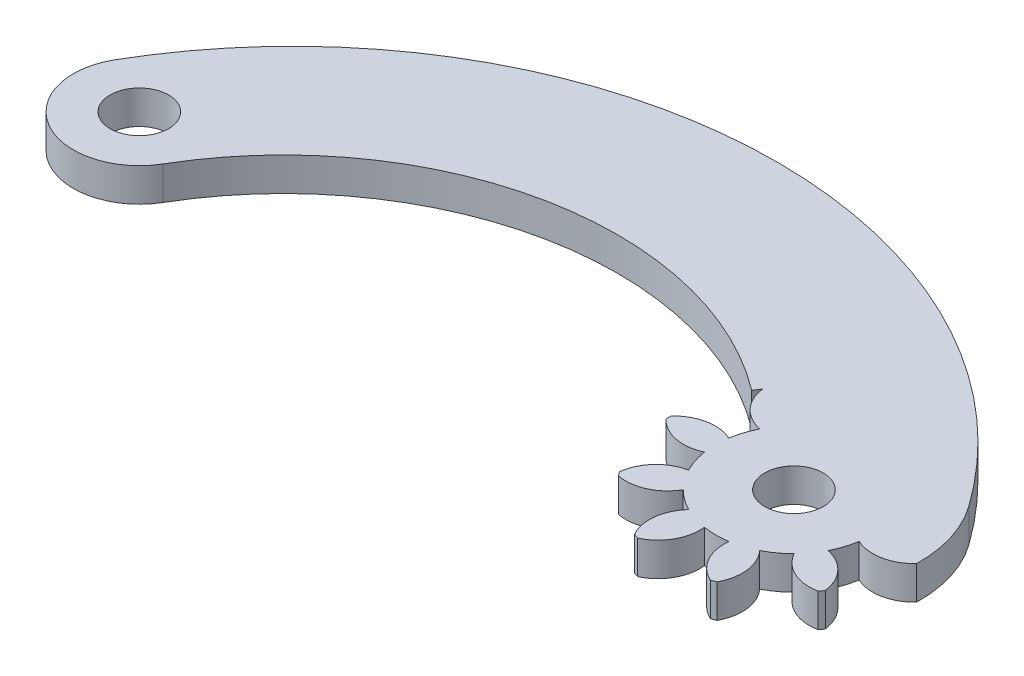
ISO-10303-21;
HEADER;
FILE_DESCRIPTION(('STEP AP214'),'2;1');
FILE_NAME('part.step','',(''),(''),'','','');
FILE_SCHEMA(('AUTOMOTIVE_DESIGN { 1 0 10303 214 1 1 1 1 }'));
ENDSEC;
DATA;
#1=APPLICATION_CONTEXT('core data for automotive mechanical design processes');
#2=APPLICATION_PROTOCOL_DEFINITION('international standard','automotive_design',2000,#1);
#3=PRODUCT_CONTEXT('',#1,'mechanical');
#4=PRODUCT('Part','Part','',(#3));
#5=PRODUCT_RELATED_PRODUCT_CATEGORY('part','',(#4));
#6=PRODUCT_DEFINITION_FORMATION('','',#4);
#7=PRODUCT_DEFINITION_CONTEXT('part definition',#1,'design');
#8=PRODUCT_DEFINITION('design','',#6,#7);
#9=PRODUCT_DEFINITION_SHAPE('','',#8);
#10=(LENGTH_UNIT() NAMED_UNIT(*) SI_UNIT(.MILLI.,.METRE.));
#11=(NAMED_UNIT(*) PLANE_ANGLE_UNIT() SI_UNIT($,.RADIAN.));
#12=(NAMED_UNIT(*) SI_UNIT($,.STERADIAN.) SOLID_ANGLE_UNIT());
#13=UNCERTAINTY_MEASURE_WITH_UNIT(LENGTH_MEASURE(1.E-05),#10,'distance_accuracy_value','');
#14=(GEOMETRIC_REPRESENTATION_CONTEXT(3) GLOBAL_UNCERTAINTY_ASSIGNED_CONTEXT((#13)) GLOBAL_UNIT_ASSIGNED_CONTEXT((#10,
#11,#12)) REPRESENTATION_CONTEXT('',''));
#15=CARTESIAN_POINT('',(0.,0.,0.));
#16=DIRECTION('',(0.,0.,1.));
#17=DIRECTION('',(1.,0.,0.));
#18=AXIS2_PLACEMENT_3D('',#15,#16,#17);
#19=CARTESIAN_POINT('',(29.9352924032025,1.,6.02984649181474));
#20=DIRECTION('',(0.,-1.,0.));
#21=DIRECTION('',(0.,0.,-1.));
#22=AXIS2_PLACEMENT_3D('',#19,#20,#21);
#23=PLANE('',#22);
#24=CARTESIAN_POINT('',(0.,1.,0.));
#25=DIRECTION('',(0.,1.,0.));
#26=DIRECTION('',(0.,0.,1.));
#27=AXIS2_PLACEMENT_3D('',#24,#25,#26);
#28=CIRCLE('',#27,1.75);
#29=CARTESIAN_POINT('',(0.,1.,1.75));
#30=VERTEX_POINT('',#29);
#31=EDGE_CURVE('E464',#30,#30,#28,.T.);
#32=ORIENTED_EDGE('',*,*,#31,.F.);
#33=EDGE_LOOP('',(#32));
#34=FACE_BOUND('',#33,.T.);
#35=CARTESIAN_POINT('',(39.178405,1.,0.));
#36=DIRECTION('',(0.,1.,0.));
#37=DIRECTION('',(0.,0.,1.));
#38=AXIS2_PLACEMENT_3D('',#35,#36,#37);
#39=CIRCLE('',#38,1.75);
#40=CARTESIAN_POINT('',(39.178405,1.,1.75));
#41=VERTEX_POINT('',#40);
#42=EDGE_CURVE('E456',#41,#41,#39,.T.);
#43=ORIENTED_EDGE('',*,*,#42,.F.);
#44=EDGE_LOOP('',(#43));
#45=FACE_BOUND('',#44,.T.);
#46=CARTESIAN_POINT('',(20.6921798064051,1.,12.0596929836295));
#47=DIRECTION('',(0.,-1.,0.));
#48=DIRECTION('',(0.,0.,-1.));
#49=AXIS2_PLACEMENT_3D('',#46,#47,#48);
#50=CIRCLE('',#49,20.);
#51=CARTESIAN_POINT('',(3.4126977133737,1.,1.98896815387626));
#52=VERTEX_POINT('',#51);
#53=CARTESIAN_POINT('',(32.7638427655675,1.,-3.88630818909049));
#54=VERTEX_POINT('',#53);
#55=EDGE_CURVE('E472',#52,#54,#50,.T.);
#56=ORIENTED_EDGE('',*,*,#55,.T.);
#57=CARTESIAN_POINT('',(39.178405,1.,0.));
#58=DIRECTION('',(0.,1.,0.));
#59=DIRECTION('',(0.,0.,1.));
#60=AXIS2_PLACEMENT_3D('',#57,#58,#59);
#61=CIRCLE('',#60,7.49999999999999);
#62=CARTESIAN_POINT('',(33.0215837942356,1.,-4.28293738458191));
#63=VERTEX_POINT('',#62);
#64=EDGE_CURVE('E262',#63,#54,#61,.T.);
#65=ORIENTED_EDGE('',*,*,#64,.F.);
#66=CARTESIAN_POINT('',(35.5036990674063,1.,-4.58143993179473));
#67=DIRECTION('',(0.,-1.,0.));
#68=DIRECTION('',(0.,0.,1.));
#69=AXIS2_PLACEMENT_3D('',#66,#67,#68);
#70=CIRCLE('',#69,2.5);
#71=CARTESIAN_POINT('',(35.0047946818285,1.,-2.13172680286489));
#72=VERTEX_POINT('',#71);
#73=EDGE_CURVE('E257',#72,#63,#70,.T.);
#74=ORIENTED_EDGE('',*,*,#73,.F.);
#75=CARTESIAN_POINT('',(39.178405,1.,0.));
#76=DIRECTION('',(0.,-1.,0.));
#77=DIRECTION('',(0.,0.,1.));
#78=AXIS2_PLACEMENT_3D('',#75,#76,#77);
#79=CIRCLE('',#78,4.6865);
#80=CARTESIAN_POINT('',(34.5488857480601,1.,-0.728583382954616));
#81=VERTEX_POINT('',#80);
#82=EDGE_CURVE('E268',#81,#72,#79,.T.);
#83=ORIENTED_EDGE('',*,*,#82,.F.);
#84=CARTESIAN_POINT('',(33.5126026250285,1.,1.54652480983972));
#85=DIRECTION('',(0.,-1.,0.));
#86=DIRECTION('',(0.,0.,1.));
#87=AXIS2_PLACEMENT_3D('',#84,#85,#86);
#88=CIRCLE('',#87,2.5);
#89=CARTESIAN_POINT('',(31.6799845820592,1.,-0.153919575779318));
#90=VERTEX_POINT('',#89);
#91=EDGE_CURVE('E230',#90,#81,#88,.T.);
#92=ORIENTED_EDGE('',*,*,#91,.F.);
#93=CARTESIAN_POINT('',(39.178405,1.,0.));
#94=DIRECTION('',(0.,1.,0.));
#95=DIRECTION('',(0.,0.,1.));
#96=AXIS2_PLACEMENT_3D('',#93,#94,#95);
#97=CIRCLE('',#96,7.49999999999999);
#98=CARTESIAN_POINT('',(31.6799845820592,1.,0.153919575779354));
#99=VERTEX_POINT('',#98);
#100=EDGE_CURVE('E481',#90,#99,#97,.T.);
#101=ORIENTED_EDGE('',*,*,#100,.T.);
#102=CARTESIAN_POINT('',(33.5126026250285,1.,-1.5465248098397));
#103=DIRECTION('',(0.,-1.,0.));
#104=DIRECTION('',(0.,0.,1.));
#105=AXIS2_PLACEMENT_3D('',#102,#103,#104);
#106=CIRCLE('',#105,2.5);
#107=CARTESIAN_POINT('',(34.5488857480601,1.,0.728583382954629));
#108=VERTEX_POINT('',#107);
#109=EDGE_CURVE('E428',#108,#99,#106,.T.);
#110=ORIENTED_EDGE('',*,*,#109,.F.);
#111=CARTESIAN_POINT('',(39.178405,1.,0.));
#112=DIRECTION('',(0.,-1.,0.));
#113=DIRECTION('',(0.,0.,1.));
#114=AXIS2_PLACEMENT_3D('',#111,#112,#113);
#115=CIRCLE('',#114,4.6865);
#116=CARTESIAN_POINT('',(35.0047946818285,1.,2.1317268028649));
#117=VERTEX_POINT('',#116);
#118=EDGE_CURVE('E439',#117,#108,#115,.T.);
#119=ORIENTED_EDGE('',*,*,#118,.F.);
#120=CARTESIAN_POINT('',(35.5036990674063,1.,4.58143993179474));
#121=DIRECTION('',(0.,-1.,0.));
#122=DIRECTION('',(0.,0.,1.));
#123=AXIS2_PLACEMENT_3D('',#120,#121,#122);
#124=CIRCLE('',#123,2.5);
#125=CARTESIAN_POINT('',(33.0215837942356,1.,4.28293738458194));
#126=VERTEX_POINT('',#125);
#127=EDGE_CURVE('E414',#126,#117,#124,.T.);
#128=ORIENTED_EDGE('',*,*,#127,.F.);
#129=CARTESIAN_POINT('',(33.2025271076,1.,4.53198448972687));
#130=VERTEX_POINT('',#129);
#131=EDGE_CURVE('E621',#126,#130,#97,.T.);
#132=ORIENTED_EDGE('',*,*,#131,.T.);
#133=CARTESIAN_POINT('',(33.6856501163499,1.,2.07911022502914));
#134=DIRECTION('',(0.,-1.,0.));
#135=DIRECTION('',(0.,0.,1.));
#136=AXIS2_PLACEMENT_3D('',#133,#134,#135);
#137=CIRCLE('',#136,2.5);
#138=CARTESIAN_POINT('',(35.8612958169607,1.,3.31059948012386));
#139=VERTEX_POINT('',#138);
#140=EDGE_CURVE('E392',#139,#130,#137,.T.);
#141=ORIENTED_EDGE('',*,*,#140,.F.);
#142=CARTESIAN_POINT('',(39.178405,1.,0.));
#143=DIRECTION('',(0.,-1.,0.));
#144=DIRECTION('',(0.,0.,1.));
#145=AXIS2_PLACEMENT_3D('',#142,#143,#144);
#146=CIRCLE('',#145,4.6865);
#147=CARTESIAN_POINT('',(37.0548809013412,1.,4.17778980471917));
#148=VERTEX_POINT('',#147);
#149=EDGE_CURVE('E404',#148,#139,#146,.T.);
#150=ORIENTED_EDGE('',*,*,#149,.F.);
#151=CARTESIAN_POINT('',(38.8984082773741,1.,5.86640071722017));
#152=DIRECTION('',(0.,-1.,0.));
#153=DIRECTION('',(0.,0.,1.));
#154=AXIS2_PLACEMENT_3D('',#151,#152,#153);
#155=CIRCLE('',#154,2.5);
#156=CARTESIAN_POINT('',(36.7148794443579,1.,7.08385783572047));
#157=VERTEX_POINT('',#156);
#158=EDGE_CURVE('E378',#157,#148,#155,.T.);
#159=ORIENTED_EDGE('',*,*,#158,.F.);
#160=CARTESIAN_POINT('',(37.0076518754186,1.,7.17898536508606));
#161=VERTEX_POINT('',#160);
#162=EDGE_CURVE('E617',#157,#161,#97,.T.);
#163=ORIENTED_EDGE('',*,*,#162,.T.);
#164=CARTESIAN_POINT('',(35.9567432813537,1.,4.91059582029428));
#165=DIRECTION('',(0.,-1.,0.));
#166=DIRECTION('',(0.,0.,1.));
#167=AXIS2_PLACEMENT_3D('',#164,#165,#166);
#168=CIRCLE('',#167,2.5);
#169=CARTESIAN_POINT('',(38.440728849388,1.,4.6280790990235));
#170=VERTEX_POINT('',#169);
#171=EDGE_CURVE('E356',#170,#161,#168,.T.);
#172=ORIENTED_EDGE('',*,*,#171,.F.);
#173=CARTESIAN_POINT('',(39.178405,1.,0.));
#174=DIRECTION('',(0.,-1.,0.));
#175=DIRECTION('',(0.,0.,1.));
#176=AXIS2_PLACEMENT_3D('',#173,#174,#175);
#177=CIRCLE('',#176,4.6865);
#178=CARTESIAN_POINT('',(39.9160811506121,1.,4.62807909902349));
#179=VERTEX_POINT('',#178);
#180=EDGE_CURVE('E368',#179,#170,#177,.T.);
#181=ORIENTED_EDGE('',*,*,#180,.F.);
#182=CARTESIAN_POINT('',(42.4000667186464,1.,4.91059582029423));
#183=DIRECTION('',(0.,-1.,0.));
#184=DIRECTION('',(0.,0.,1.));
#185=AXIS2_PLACEMENT_3D('',#182,#183,#184);
#186=CIRCLE('',#185,2.5);
#187=CARTESIAN_POINT('',(41.3491581245815,1.,7.17898536508603));
#188=VERTEX_POINT('',#187);
#189=EDGE_CURVE('E342',#188,#179,#186,.T.);
#190=ORIENTED_EDGE('',*,*,#189,.F.);
#191=CARTESIAN_POINT('',(41.6419305556422,1.,7.08385783572043));
#192=VERTEX_POINT('',#191);
#193=EDGE_CURVE('E622',#188,#192,#97,.T.);
#194=ORIENTED_EDGE('',*,*,#193,.T.);
#195=CARTESIAN_POINT('',(39.458401722626,1.,5.86640071722016));
#196=DIRECTION('',(0.,-1.,0.));
#197=DIRECTION('',(0.,0.,1.));
#198=AXIS2_PLACEMENT_3D('',#195,#196,#197);
#199=CIRCLE('',#198,2.5);
#200=CARTESIAN_POINT('',(41.3019290986588,1.,4.17778980471913));
#201=VERTEX_POINT('',#200);
#202=EDGE_CURVE('E320',#201,#192,#199,.T.);
#203=ORIENTED_EDGE('',*,*,#202,.F.);
#204=CARTESIAN_POINT('',(39.178405,1.,0.));
#205=DIRECTION('',(0.,-1.,0.));
#206=DIRECTION('',(0.,0.,1.));
#207=AXIS2_PLACEMENT_3D('',#204,#205,#206);
#208=CIRCLE('',#207,4.6865);
#209=CARTESIAN_POINT('',(42.4955141830393,1.,3.31059948012381));
#210=VERTEX_POINT('',#209);
#211=EDGE_CURVE('E332',#210,#201,#208,.T.);
#212=ORIENTED_EDGE('',*,*,#211,.F.);
#213=CARTESIAN_POINT('',(44.6711598836501,1.,2.07911022502905));
#214=DIRECTION('',(0.,-1.,0.));
#215=DIRECTION('',(0.,0.,1.));
#216=AXIS2_PLACEMENT_3D('',#213,#214,#215);
#217=CIRCLE('',#216,2.5);
#218=CARTESIAN_POINT('',(45.1542828924001,1.,4.53198448972678));
#219=VERTEX_POINT('',#218);
#220=EDGE_CURVE('E308',#219,#210,#217,.T.);
#221=ORIENTED_EDGE('',*,*,#220,.F.);
#222=CARTESIAN_POINT('',(45.3352262057645,1.,4.28293738458185));
#223=VERTEX_POINT('',#222);
#224=EDGE_CURVE('E480',#219,#223,#97,.T.);
#225=ORIENTED_EDGE('',*,*,#224,.T.);
#226=CARTESIAN_POINT('',(42.8531109325937,1.,4.58143993179469));
#227=DIRECTION('',(0.,-1.,0.));
#228=DIRECTION('',(0.,0.,1.));
#229=AXIS2_PLACEMENT_3D('',#226,#227,#228);
#230=CIRCLE('',#229,2.5);
#231=CARTESIAN_POINT('',(43.3520153181715,1.,2.13172680286484));
#232=VERTEX_POINT('',#231);
#233=EDGE_CURVE('E285',#232,#223,#230,.T.);
#234=ORIENTED_EDGE('',*,*,#233,.F.);
#235=CARTESIAN_POINT('',(39.178405,1.,0.));
#236=DIRECTION('',(0.,-1.,0.));
#237=DIRECTION('',(0.,0.,1.));
#238=AXIS2_PLACEMENT_3D('',#235,#236,#237);
#239=CIRCLE('',#238,4.6865);
#240=CARTESIAN_POINT('',(43.8079242519399,1.,0.72858338295456));
#241=VERTEX_POINT('',#240);
#242=EDGE_CURVE('E298',#241,#232,#239,.T.);
#243=ORIENTED_EDGE('',*,*,#242,.F.);
#244=CARTESIAN_POINT('',(44.8442073749715,1.,-1.54652480983978));
#245=DIRECTION('',(0.,-1.,0.));
#246=DIRECTION('',(0.,0.,1.));
#247=AXIS2_PLACEMENT_3D('',#244,#245,#246);
#248=CIRCLE('',#247,2.5);
#249=CARTESIAN_POINT('',(46.6768254179408,1.,0.153919575779254));
#250=VERTEX_POINT('',#249);
#251=EDGE_CURVE('E294',#250,#241,#248,.T.);
#252=ORIENTED_EDGE('',*,*,#251,.F.);
#253=CARTESIAN_POINT('',(45.2761590166669,1.,-4.36662294596436));
#254=VERTEX_POINT('',#253);
#255=EDGE_CURVE('E476',#250,#254,#97,.T.);
#256=ORIENTED_EDGE('',*,*,#255,.T.);
#257=CARTESIAN_POINT('',(21.6981768188882,1.,12.5176524450978));
#258=DIRECTION('',(0.,1.,0.));
#259=DIRECTION('',(0.,0.,-1.));
#260=AXIS2_PLACEMENT_3D('',#257,#258,#259);
#261=CIRCLE('',#260,29.);
#262=CARTESIAN_POINT('',(-3.42146899938556,1.,-1.97384140351842));
#263=VERTEX_POINT('',#262);
#264=EDGE_CURVE('E482',#254,#263,#261,.T.);
#265=ORIENTED_EDGE('',*,*,#264,.T.);
#266=CARTESIAN_POINT('',(0.,1.,0.));
#267=DIRECTION('',(0.,1.,0.));
#268=DIRECTION('',(0.,0.,1.));
#269=AXIS2_PLACEMENT_3D('',#266,#267,#268);
#270=CIRCLE('',#269,3.95);
#271=EDGE_CURVE('E485',#263,#52,#270,.T.);
#272=ORIENTED_EDGE('',*,*,#271,.T.);
#273=EDGE_LOOP('',(#56,#65,#74,#83,#92,#101,#110,#119,#128,#132,#141,#150,#159,#163,#172,#181,
#190,#194,#203,#212,#221,#225,#234,#243,#252,#256,#265,#272));
#274=FACE_BOUND('',#273,.T.);
#275=ADVANCED_FACE('F39',(#34,#45,#274),#23,.F.);
#276=CARTESIAN_POINT('',(29.9352924032025,-1.,6.02984649181474));
#277=DIRECTION('',(0.,-1.,0.));
#278=DIRECTION('',(0.,0.,-1.));
#279=AXIS2_PLACEMENT_3D('',#276,#277,#278);
#280=PLANE('',#279);
#281=CARTESIAN_POINT('',(0.,-1.,0.));
#282=DIRECTION('',(0.,1.,0.));
#283=DIRECTION('',(0.,0.,1.));
#284=AXIS2_PLACEMENT_3D('',#281,#282,#283);
#285=CIRCLE('',#284,1.75);
#286=CARTESIAN_POINT('',(0.,-1.,1.75));
#287=VERTEX_POINT('',#286);
#288=EDGE_CURVE('E460',#287,#287,#285,.T.);
#289=ORIENTED_EDGE('',*,*,#288,.T.);
#290=EDGE_LOOP('',(#289));
#291=FACE_BOUND('',#290,.T.);
#292=CARTESIAN_POINT('',(39.178405,-1.,0.));
#293=DIRECTION('',(0.,1.,0.));
#294=DIRECTION('',(0.,0.,1.));
#295=AXIS2_PLACEMENT_3D('',#292,#293,#294);
#296=CIRCLE('',#295,1.75);
#297=CARTESIAN_POINT('',(39.178405,-1.,1.75));
#298=VERTEX_POINT('',#297);
#299=EDGE_CURVE('E277',#298,#298,#296,.T.);
#300=ORIENTED_EDGE('',*,*,#299,.T.);
#301=EDGE_LOOP('',(#300));
#302=FACE_BOUND('',#301,.T.);
#303=CARTESIAN_POINT('',(39.178405,-1.,0.));
#304=DIRECTION('',(0.,1.,0.));
#305=DIRECTION('',(0.,0.,1.));
#306=AXIS2_PLACEMENT_3D('',#303,#304,#305);
#307=CIRCLE('',#306,7.49999999999999);
#308=CARTESIAN_POINT('',(33.0215837942356,-1.,-4.28293738458191));
#309=VERTEX_POINT('',#308);
#310=CARTESIAN_POINT('',(32.7638427655675,-1.,-3.88630818909049));
#311=VERTEX_POINT('',#310);
#312=EDGE_CURVE('E254',#309,#311,#307,.T.);
#313=ORIENTED_EDGE('',*,*,#312,.T.);
#314=CARTESIAN_POINT('',(20.6921798064051,-1.,12.0596929836295));
#315=DIRECTION('',(0.,-1.,0.));
#316=DIRECTION('',(0.,0.,-1.));
#317=AXIS2_PLACEMENT_3D('',#314,#315,#316);
#318=CIRCLE('',#317,20.);
#319=CARTESIAN_POINT('',(3.4126977133737,-1.,1.98896815387626));
#320=VERTEX_POINT('',#319);
#321=EDGE_CURVE('E468',#320,#311,#318,.T.);
#322=ORIENTED_EDGE('',*,*,#321,.F.);
#323=CARTESIAN_POINT('',(0.,-1.,0.));
#324=DIRECTION('',(0.,1.,0.));
#325=DIRECTION('',(0.,0.,1.));
#326=AXIS2_PLACEMENT_3D('',#323,#324,#325);
#327=CIRCLE('',#326,3.95);
#328=CARTESIAN_POINT('',(-3.42146899938556,-1.,-1.97384140351842));
#329=VERTEX_POINT('',#328);
#330=EDGE_CURVE('E477',#329,#320,#327,.T.);
#331=ORIENTED_EDGE('',*,*,#330,.F.);
#332=CARTESIAN_POINT('',(21.6981768188882,-1.,12.5176524450978));
#333=DIRECTION('',(0.,1.,0.));
#334=DIRECTION('',(0.,0.,-1.));
#335=AXIS2_PLACEMENT_3D('',#332,#333,#334);
#336=CIRCLE('',#335,29.);
#337=CARTESIAN_POINT('',(45.2761590166669,-1.,-4.36662294596436));
#338=VERTEX_POINT('',#337);
#339=EDGE_CURVE('E496',#338,#329,#336,.T.);
#340=ORIENTED_EDGE('',*,*,#339,.F.);
#341=CARTESIAN_POINT('',(39.178405,-1.,0.));
#342=DIRECTION('',(0.,1.,0.));
#343=DIRECTION('',(0.,0.,1.));
#344=AXIS2_PLACEMENT_3D('',#341,#342,#343);
#345=CIRCLE('',#344,7.49999999999999);
#346=CARTESIAN_POINT('',(46.6768254179408,-1.,0.153919575779254));
#347=VERTEX_POINT('',#346);
#348=EDGE_CURVE('E492',#347,#338,#345,.T.);
#349=ORIENTED_EDGE('',*,*,#348,.F.);
#350=CARTESIAN_POINT('',(44.8442073749715,-1.,-1.54652480983978));
#351=DIRECTION('',(0.,-1.,0.));
#352=DIRECTION('',(0.,0.,1.));
#353=AXIS2_PLACEMENT_3D('',#350,#351,#352);
#354=CIRCLE('',#353,2.5);
#355=CARTESIAN_POINT('',(43.8079242519399,-1.,0.72858338295456));
#356=VERTEX_POINT('',#355);
#357=EDGE_CURVE('E55',#347,#356,#354,.T.);
#358=ORIENTED_EDGE('',*,*,#357,.T.);
#359=CARTESIAN_POINT('',(39.178405,-1.,0.));
#360=DIRECTION('',(0.,-1.,0.));
#361=DIRECTION('',(0.,0.,1.));
#362=AXIS2_PLACEMENT_3D('',#359,#360,#361);
#363=CIRCLE('',#362,4.6865);
#364=CARTESIAN_POINT('',(43.3520153181715,-1.,2.13172680286484));
#365=VERTEX_POINT('',#364);
#366=EDGE_CURVE('E284',#356,#365,#363,.T.);
#367=ORIENTED_EDGE('',*,*,#366,.T.);
#368=CARTESIAN_POINT('',(42.8531109325937,-1.,4.58143993179469));
#369=DIRECTION('',(0.,-1.,0.));
#370=DIRECTION('',(0.,0.,1.));
#371=AXIS2_PLACEMENT_3D('',#368,#369,#370);
#372=CIRCLE('',#371,2.5);
#373=CARTESIAN_POINT('',(45.3352262057645,-1.,4.28293738458185));
#374=VERTEX_POINT('',#373);
#375=EDGE_CURVE('E289',#365,#374,#372,.T.);
#376=ORIENTED_EDGE('',*,*,#375,.T.);
#377=CARTESIAN_POINT('',(45.1542828924001,-1.,4.53198448972677));
#378=VERTEX_POINT('',#377);
#379=EDGE_CURVE('E495',#378,#374,#345,.T.);
#380=ORIENTED_EDGE('',*,*,#379,.F.);
#381=CARTESIAN_POINT('',(44.6711598836501,-1.,2.07911022502905));
#382=DIRECTION('',(0.,-1.,0.));
#383=DIRECTION('',(0.,0.,1.));
#384=AXIS2_PLACEMENT_3D('',#381,#382,#383);
#385=CIRCLE('',#384,2.5);
#386=CARTESIAN_POINT('',(42.4955141830393,-1.,3.31059948012381));
#387=VERTEX_POINT('',#386);
#388=EDGE_CURVE('E63',#378,#387,#385,.T.);
#389=ORIENTED_EDGE('',*,*,#388,.T.);
#390=CARTESIAN_POINT('',(39.178405,-1.,0.));
#391=DIRECTION('',(0.,-1.,0.));
#392=DIRECTION('',(0.,0.,1.));
#393=AXIS2_PLACEMENT_3D('',#390,#391,#392);
#394=CIRCLE('',#393,4.6865);
#395=CARTESIAN_POINT('',(41.3019290986588,-1.,4.17778980471913));
#396=VERTEX_POINT('',#395);
#397=EDGE_CURVE('E319',#387,#396,#394,.T.);
#398=ORIENTED_EDGE('',*,*,#397,.T.);
#399=CARTESIAN_POINT('',(39.458401722626,-1.,5.86640071722016));
#400=DIRECTION('',(0.,-1.,0.));
#401=DIRECTION('',(0.,0.,1.));
#402=AXIS2_PLACEMENT_3D('',#399,#400,#401);
#403=CIRCLE('',#402,2.5);
#404=CARTESIAN_POINT('',(41.6419305556422,-1.,7.08385783572043));
#405=VERTEX_POINT('',#404);
#406=EDGE_CURVE('E324',#396,#405,#403,.T.);
#407=ORIENTED_EDGE('',*,*,#406,.T.);
#408=CARTESIAN_POINT('',(41.3491581245815,-1.,7.17898536508602));
#409=VERTEX_POINT('',#408);
#410=EDGE_CURVE('E547',#409,#405,#345,.T.);
#411=ORIENTED_EDGE('',*,*,#410,.F.);
#412=CARTESIAN_POINT('',(42.4000667186464,-1.,4.91059582029423));
#413=DIRECTION('',(0.,-1.,0.));
#414=DIRECTION('',(0.,0.,1.));
#415=AXIS2_PLACEMENT_3D('',#412,#413,#414);
#416=CIRCLE('',#415,2.5);
#417=CARTESIAN_POINT('',(39.9160811506121,-1.,4.62807909902349));
#418=VERTEX_POINT('',#417);
#419=EDGE_CURVE('E351',#409,#418,#416,.T.);
#420=ORIENTED_EDGE('',*,*,#419,.T.);
#421=CARTESIAN_POINT('',(39.178405,-1.,0.));
#422=DIRECTION('',(0.,-1.,0.));
#423=DIRECTION('',(0.,0.,1.));
#424=AXIS2_PLACEMENT_3D('',#421,#422,#423);
#425=CIRCLE('',#424,4.6865);
#426=CARTESIAN_POINT('',(38.440728849388,-1.,4.6280790990235));
#427=VERTEX_POINT('',#426);
#428=EDGE_CURVE('E355',#418,#427,#425,.T.);
#429=ORIENTED_EDGE('',*,*,#428,.T.);
#430=CARTESIAN_POINT('',(35.9567432813537,-1.,4.91059582029428));
#431=DIRECTION('',(0.,-1.,0.));
#432=DIRECTION('',(0.,0.,1.));
#433=AXIS2_PLACEMENT_3D('',#430,#431,#432);
#434=CIRCLE('',#433,2.5);
#435=CARTESIAN_POINT('',(37.0076518754186,-1.,7.17898536508606));
#436=VERTEX_POINT('',#435);
#437=EDGE_CURVE('E360',#427,#436,#434,.T.);
#438=ORIENTED_EDGE('',*,*,#437,.T.);
#439=CARTESIAN_POINT('',(36.7148794443579,-1.,7.08385783572046));
#440=VERTEX_POINT('',#439);
#441=EDGE_CURVE('E550',#440,#436,#345,.T.);
#442=ORIENTED_EDGE('',*,*,#441,.F.);
#443=CARTESIAN_POINT('',(38.8984082773741,-1.,5.86640071722017));
#444=DIRECTION('',(0.,-1.,0.));
#445=DIRECTION('',(0.,0.,1.));
#446=AXIS2_PLACEMENT_3D('',#443,#444,#445);
#447=CIRCLE('',#446,2.5);
#448=CARTESIAN_POINT('',(37.0548809013412,-1.,4.17778980471917));
#449=VERTEX_POINT('',#448);
#450=EDGE_CURVE('E387',#440,#449,#447,.T.);
#451=ORIENTED_EDGE('',*,*,#450,.T.);
#452=CARTESIAN_POINT('',(39.178405,-1.,0.));
#453=DIRECTION('',(0.,-1.,0.));
#454=DIRECTION('',(0.,0.,1.));
#455=AXIS2_PLACEMENT_3D('',#452,#453,#454);
#456=CIRCLE('',#455,4.6865);
#457=CARTESIAN_POINT('',(35.8612958169607,-1.,3.31059948012386));
#458=VERTEX_POINT('',#457);
#459=EDGE_CURVE('E391',#449,#458,#456,.T.);
#460=ORIENTED_EDGE('',*,*,#459,.T.);
#461=CARTESIAN_POINT('',(33.6856501163499,-1.,2.07911022502914));
#462=DIRECTION('',(0.,-1.,0.));
#463=DIRECTION('',(0.,0.,1.));
#464=AXIS2_PLACEMENT_3D('',#461,#462,#463);
#465=CIRCLE('',#464,2.5);
#466=CARTESIAN_POINT('',(33.2025271076,-1.,4.53198448972687));
#467=VERTEX_POINT('',#466);
#468=EDGE_CURVE('E396',#458,#467,#465,.T.);
#469=ORIENTED_EDGE('',*,*,#468,.T.);
#470=CARTESIAN_POINT('',(33.0215837942356,-1.,4.28293738458193));
#471=VERTEX_POINT('',#470);
#472=EDGE_CURVE('E556',#471,#467,#345,.T.);
#473=ORIENTED_EDGE('',*,*,#472,.F.);
#474=CARTESIAN_POINT('',(35.5036990674063,-1.,4.58143993179474));
#475=DIRECTION('',(0.,-1.,0.));
#476=DIRECTION('',(0.,0.,1.));
#477=AXIS2_PLACEMENT_3D('',#474,#475,#476);
#478=CIRCLE('',#477,2.5);
#479=CARTESIAN_POINT('',(35.0047946818285,-1.,2.1317268028649));
#480=VERTEX_POINT('',#479);
#481=EDGE_CURVE('E423',#471,#480,#478,.T.);
#482=ORIENTED_EDGE('',*,*,#481,.T.);
#483=CARTESIAN_POINT('',(39.178405,-1.,0.));
#484=DIRECTION('',(0.,-1.,0.));
#485=DIRECTION('',(0.,0.,1.));
#486=AXIS2_PLACEMENT_3D('',#483,#484,#485);
#487=CIRCLE('',#486,4.6865);
#488=CARTESIAN_POINT('',(34.5488857480601,-1.,0.728583382954629));
#489=VERTEX_POINT('',#488);
#490=EDGE_CURVE('E427',#480,#489,#487,.T.);
#491=ORIENTED_EDGE('',*,*,#490,.T.);
#492=CARTESIAN_POINT('',(33.5126026250285,-1.,-1.5465248098397));
#493=DIRECTION('',(0.,-1.,0.));
#494=DIRECTION('',(0.,0.,1.));
#495=AXIS2_PLACEMENT_3D('',#492,#493,#494);
#496=CIRCLE('',#495,2.5);
#497=CARTESIAN_POINT('',(31.6799845820592,-1.,0.153919575779354));
#498=VERTEX_POINT('',#497);
#499=EDGE_CURVE('E432',#489,#498,#496,.T.);
#500=ORIENTED_EDGE('',*,*,#499,.T.);
#501=CARTESIAN_POINT('',(31.6799845820592,-1.,-0.153919575779318));
#502=VERTEX_POINT('',#501);
#503=EDGE_CURVE('E252',#502,#498,#345,.T.);
#504=ORIENTED_EDGE('',*,*,#503,.F.);
#505=CARTESIAN_POINT('',(33.5126026250285,-1.,1.54652480983972));
#506=DIRECTION('',(0.,-1.,0.));
#507=DIRECTION('',(0.,0.,1.));
#508=AXIS2_PLACEMENT_3D('',#505,#506,#507);
#509=CIRCLE('',#508,2.5);
#510=CARTESIAN_POINT('',(34.5488857480601,-1.,-0.728583382954616));
#511=VERTEX_POINT('',#510);
#512=EDGE_CURVE('E227',#502,#511,#509,.T.);
#513=ORIENTED_EDGE('',*,*,#512,.T.);
#514=CARTESIAN_POINT('',(39.178405,-1.,0.));
#515=DIRECTION('',(0.,-1.,0.));
#516=DIRECTION('',(0.,0.,1.));
#517=AXIS2_PLACEMENT_3D('',#514,#515,#516);
#518=CIRCLE('',#517,4.6865);
#519=CARTESIAN_POINT('',(35.0047946818285,-1.,-2.13172680286489));
#520=VERTEX_POINT('',#519);
#521=EDGE_CURVE('E239',#511,#520,#518,.T.);
#522=ORIENTED_EDGE('',*,*,#521,.T.);
#523=CARTESIAN_POINT('',(35.5036990674063,-1.,-4.58143993179473));
#524=DIRECTION('',(0.,-1.,0.));
#525=DIRECTION('',(0.,0.,1.));
#526=AXIS2_PLACEMENT_3D('',#523,#524,#525);
#527=CIRCLE('',#526,2.5);
#528=EDGE_CURVE('E245',#520,#309,#527,.T.);
#529=ORIENTED_EDGE('',*,*,#528,.T.);
#530=EDGE_LOOP('',(#313,#322,#331,#340,#349,#358,#367,#376,#380,#389,#398,#407,#411,#420,#429,
#438,#442,#451,#460,#469,#473,#482,#491,#500,#504,#513,#522,#529));
#531=FACE_BOUND('',#530,.T.);
#532=ADVANCED_FACE('F249',(#291,#302,#531),#280,.T.);
#533=CARTESIAN_POINT('',(39.178405,1.,0.));
#534=DIRECTION('',(0.,-1.,0.));
#535=DIRECTION('',(0.,0.,-1.));
#536=AXIS2_PLACEMENT_3D('',#533,#534,#535);
#537=CYLINDRICAL_SURFACE('',#536,7.49999999999999);
#538=ORIENTED_EDGE('',*,*,#379,.T.);
#539=DIRECTION('',(0.,1.,0.));
#540=VECTOR('',#539,1.);
#541=CARTESIAN_POINT('',(45.3352262057645,-1.,4.28293738458185));
#542=LINE('',#541,#540);
#543=EDGE_CURVE('E304',#374,#223,#542,.T.);
#544=ORIENTED_EDGE('',*,*,#543,.T.);
#545=ORIENTED_EDGE('',*,*,#224,.F.);
#546=DIRECTION('',(0.,1.,0.));
#547=VECTOR('',#546,1.);
#548=CARTESIAN_POINT('',(45.1542828924001,-1.,4.53198448972678));
#549=LINE('',#548,#547);
#550=EDGE_CURVE('E328',#378,#219,#549,.T.);
#551=ORIENTED_EDGE('',*,*,#550,.F.);
#552=EDGE_LOOP('',(#538,#544,#545,#551));
#553=FACE_BOUND('',#552,.T.);
#554=ADVANCED_FACE('F544',(#553),#537,.T.);
#555=ORIENTED_EDGE('',*,*,#472,.T.);
#556=DIRECTION('',(0.,1.,0.));
#557=VECTOR('',#556,1.);
#558=CARTESIAN_POINT('',(33.2025271076,-1.,4.53198448972687));
#559=LINE('',#558,#557);
#560=EDGE_CURVE('E410',#467,#130,#559,.T.);
#561=ORIENTED_EDGE('',*,*,#560,.T.);
#562=ORIENTED_EDGE('',*,*,#131,.F.);
#563=DIRECTION('',(0.,1.,0.));
#564=VECTOR('',#563,1.);
#565=CARTESIAN_POINT('',(33.0215837942356,-1.,4.28293738458194));
#566=LINE('',#565,#564);
#567=EDGE_CURVE('E435',#471,#126,#566,.T.);
#568=ORIENTED_EDGE('',*,*,#567,.F.);
#569=EDGE_LOOP('',(#555,#561,#562,#568));
#570=FACE_BOUND('',#569,.T.);
#571=ADVANCED_FACE('F609',(#570),#537,.T.);
#572=ORIENTED_EDGE('',*,*,#100,.F.);
#573=DIRECTION('',(0.,1.,0.));
#574=VECTOR('',#573,1.);
#575=CARTESIAN_POINT('',(31.6799845820592,-1.,-0.153919575779318));
#576=LINE('',#575,#574);
#577=EDGE_CURVE('E236',#502,#90,#576,.T.);
#578=ORIENTED_EDGE('',*,*,#577,.F.);
#579=ORIENTED_EDGE('',*,*,#503,.T.);
#580=DIRECTION('',(0.,1.,0.));
#581=VECTOR('',#580,1.);
#582=CARTESIAN_POINT('',(31.6799845820592,-1.,0.153919575779354));
#583=LINE('',#582,#581);
#584=EDGE_CURVE('E265',#498,#99,#583,.T.);
#585=ORIENTED_EDGE('',*,*,#584,.T.);
#586=EDGE_LOOP('',(#572,#578,#579,#585));
#587=FACE_BOUND('',#586,.T.);
#588=ADVANCED_FACE('F568',(#587),#537,.T.);
#589=ORIENTED_EDGE('',*,*,#410,.T.);
#590=DIRECTION('',(0.,1.,0.));
#591=VECTOR('',#590,1.);
#592=CARTESIAN_POINT('',(41.6419305556422,-1.,7.08385783572043));
#593=LINE('',#592,#591);
#594=EDGE_CURVE('E338',#405,#192,#593,.T.);
#595=ORIENTED_EDGE('',*,*,#594,.T.);
#596=ORIENTED_EDGE('',*,*,#193,.F.);
#597=DIRECTION('',(0.,1.,0.));
#598=VECTOR('',#597,1.);
#599=CARTESIAN_POINT('',(41.3491581245815,-1.,7.17898536508603));
#600=LINE('',#599,#598);
#601=EDGE_CURVE('E364',#409,#188,#600,.T.);
#602=ORIENTED_EDGE('',*,*,#601,.F.);
#603=EDGE_LOOP('',(#589,#595,#596,#602));
#604=FACE_BOUND('',#603,.T.);
#605=ADVANCED_FACE('F611',(#604),#537,.T.);
#606=ORIENTED_EDGE('',*,*,#162,.F.);
#607=DIRECTION('',(0.,1.,0.));
#608=VECTOR('',#607,1.);
#609=CARTESIAN_POINT('',(36.7148794443579,-1.,7.08385783572047));
#610=LINE('',#609,#608);
#611=EDGE_CURVE('E400',#440,#157,#610,.T.);
#612=ORIENTED_EDGE('',*,*,#611,.F.);
#613=ORIENTED_EDGE('',*,*,#441,.T.);
#614=DIRECTION('',(0.,1.,0.));
#615=VECTOR('',#614,1.);
#616=CARTESIAN_POINT('',(37.0076518754186,-1.,7.17898536508606));
#617=LINE('',#616,#615);
#618=EDGE_CURVE('E374',#436,#161,#617,.T.);
#619=ORIENTED_EDGE('',*,*,#618,.T.);
#620=EDGE_LOOP('',(#606,#612,#613,#619));
#621=FACE_BOUND('',#620,.T.);
#622=ADVANCED_FACE('F604',(#621),#537,.T.);
#623=CARTESIAN_POINT('',(20.6921798064051,1.,12.0596929836295));
#624=DIRECTION('',(0.,-1.,0.));
#625=DIRECTION('',(0.,0.,-1.));
#626=AXIS2_PLACEMENT_3D('',#623,#624,#625);
#627=CYLINDRICAL_SURFACE('',#626,20.);
#628=ORIENTED_EDGE('',*,*,#321,.T.);
#629=DIRECTION('',(0.,-1.,0.));
#630=VECTOR('',#629,1.);
#631=CARTESIAN_POINT('',(32.7638427655675,1.,-3.88630818909049));
#632=LINE('',#631,#630);
#633=EDGE_CURVE('E11',#54,#311,#632,.T.);
#634=ORIENTED_EDGE('',*,*,#633,.F.);
#635=ORIENTED_EDGE('',*,*,#55,.F.);
#636=DIRECTION('',(0.,-1.,0.));
#637=VECTOR('',#636,1.);
#638=CARTESIAN_POINT('',(3.4126977133737,1.,1.98896815387626));
#639=LINE('',#638,#637);
#640=EDGE_CURVE('E488',#52,#320,#639,.T.);
#641=ORIENTED_EDGE('',*,*,#640,.T.);
#642=EDGE_LOOP('',(#628,#634,#635,#641));
#643=FACE_BOUND('',#642,.T.);
#644=ADVANCED_FACE('F41',(#643),#627,.F.);
#645=ORIENTED_EDGE('',*,*,#255,.F.);
#646=DIRECTION('',(0.,1.,0.));
#647=VECTOR('',#646,1.);
#648=CARTESIAN_POINT('',(46.6768254179408,-1.,0.153919575779254));
#649=LINE('',#648,#647);
#650=EDGE_CURVE('E293',#347,#250,#649,.T.);
#651=ORIENTED_EDGE('',*,*,#650,.F.);
#652=ORIENTED_EDGE('',*,*,#348,.T.);
#653=DIRECTION('',(0.,-1.,0.));
#654=VECTOR('',#653,1.);
#655=CARTESIAN_POINT('',(45.2761590166669,1.,-4.36662294596436));
#656=LINE('',#655,#654);
#657=EDGE_CURVE('E48',#254,#338,#656,.T.);
#658=ORIENTED_EDGE('',*,*,#657,.F.);
#659=EDGE_LOOP('',(#645,#651,#652,#658));
#660=FACE_BOUND('',#659,.T.);
#661=ADVANCED_FACE('F532',(#660),#537,.T.);
#662=CARTESIAN_POINT('',(21.6981768188882,1.,12.5176524450978));
#663=DIRECTION('',(0.,-1.,0.));
#664=DIRECTION('',(0.,0.,-1.));
#665=AXIS2_PLACEMENT_3D('',#662,#663,#664);
#666=CYLINDRICAL_SURFACE('',#665,29.);
#667=ORIENTED_EDGE('',*,*,#339,.T.);
#668=DIRECTION('',(0.,-1.,0.));
#669=VECTOR('',#668,1.);
#670=CARTESIAN_POINT('',(-3.42146899938556,1.,-1.97384140351842));
#671=LINE('',#670,#669);
#672=EDGE_CURVE('E504',#263,#329,#671,.T.);
#673=ORIENTED_EDGE('',*,*,#672,.F.);
#674=ORIENTED_EDGE('',*,*,#264,.F.);
#675=ORIENTED_EDGE('',*,*,#657,.T.);
#676=EDGE_LOOP('',(#667,#673,#674,#675));
#677=FACE_BOUND('',#676,.T.);
#678=ADVANCED_FACE('F513',(#677),#666,.T.);
#679=CARTESIAN_POINT('',(0.,1.,0.));
#680=DIRECTION('',(0.,-1.,0.));
#681=DIRECTION('',(0.,0.,-1.));
#682=AXIS2_PLACEMENT_3D('',#679,#680,#681);
#683=CYLINDRICAL_SURFACE('',#682,3.95);
#684=ORIENTED_EDGE('',*,*,#330,.T.);
#685=ORIENTED_EDGE('',*,*,#640,.F.);
#686=ORIENTED_EDGE('',*,*,#271,.F.);
#687=ORIENTED_EDGE('',*,*,#672,.T.);
#688=EDGE_LOOP('',(#684,#685,#686,#687));
#689=FACE_BOUND('',#688,.T.);
#690=ADVANCED_FACE('F522',(#689),#683,.T.);
#691=CARTESIAN_POINT('',(0.,1.,0.));
#692=DIRECTION('',(0.,-1.,0.));
#693=DIRECTION('',(0.,0.,-1.));
#694=AXIS2_PLACEMENT_3D('',#691,#692,#693);
#695=CYLINDRICAL_SURFACE('',#694,1.75);
#696=ORIENTED_EDGE('',*,*,#31,.T.);
#697=EDGE_LOOP('',(#696));
#698=FACE_BOUND('',#697,.T.);
#699=ORIENTED_EDGE('',*,*,#288,.F.);
#700=EDGE_LOOP('',(#699));
#701=FACE_BOUND('',#700,.T.);
#702=ADVANCED_FACE('F597',(#698,#701),#695,.F.);
#703=CARTESIAN_POINT('',(39.178405,1.,0.));
#704=DIRECTION('',(0.,-1.,0.));
#705=DIRECTION('',(0.,0.,-1.));
#706=AXIS2_PLACEMENT_3D('',#703,#704,#705);
#707=CYLINDRICAL_SURFACE('',#706,1.75);
#708=ORIENTED_EDGE('',*,*,#42,.T.);
#709=EDGE_LOOP('',(#708));
#710=FACE_BOUND('',#709,.T.);
#711=ORIENTED_EDGE('',*,*,#299,.F.);
#712=EDGE_LOOP('',(#711));
#713=FACE_BOUND('',#712,.T.);
#714=ADVANCED_FACE('F650',(#710,#713),#707,.F.);
#715=CARTESIAN_POINT('',(35.9567432813537,-1.,4.91059582029428));
#716=DIRECTION('',(0.,1.,0.));
#717=DIRECTION('',(0.,0.,1.));
#718=AXIS2_PLACEMENT_3D('',#715,#716,#717);
#719=CYLINDRICAL_SURFACE('',#718,2.5);
#720=ORIENTED_EDGE('',*,*,#171,.T.);
#721=ORIENTED_EDGE('',*,*,#618,.F.);
#722=ORIENTED_EDGE('',*,*,#437,.F.);
#723=DIRECTION('',(0.,1.,0.));
#724=VECTOR('',#723,1.);
#725=CARTESIAN_POINT('',(38.440728849388,-1.,4.6280790990235));
#726=LINE('',#725,#724);
#727=EDGE_CURVE('E379',#427,#170,#726,.T.);
#728=ORIENTED_EDGE('',*,*,#727,.T.);
#729=EDGE_LOOP('',(#720,#721,#722,#728));
#730=FACE_BOUND('',#729,.T.);
#731=ADVANCED_FACE('F648',(#730),#719,.T.);
#732=CARTESIAN_POINT('',(39.178405,-1.,0.));
#733=DIRECTION('',(0.,1.,0.));
#734=DIRECTION('',(0.,0.,1.));
#735=AXIS2_PLACEMENT_3D('',#732,#733,#734);
#736=CYLINDRICAL_SURFACE('',#735,4.6865);
#737=ORIENTED_EDGE('',*,*,#180,.T.);
#738=ORIENTED_EDGE('',*,*,#727,.F.);
#739=ORIENTED_EDGE('',*,*,#428,.F.);
#740=DIRECTION('',(0.,1.,0.));
#741=VECTOR('',#740,1.);
#742=CARTESIAN_POINT('',(39.9160811506121,-1.,4.62807909902349));
#743=LINE('',#742,#741);
#744=EDGE_CURVE('E382',#418,#179,#743,.T.);
#745=ORIENTED_EDGE('',*,*,#744,.T.);
#746=EDGE_LOOP('',(#737,#738,#739,#745));
#747=FACE_BOUND('',#746,.T.);
#748=ADVANCED_FACE('F644',(#747),#736,.T.);
#749=CARTESIAN_POINT('',(42.4000667186464,-1.,4.91059582029423));
#750=DIRECTION('',(0.,1.,0.));
#751=DIRECTION('',(0.,0.,1.));
#752=AXIS2_PLACEMENT_3D('',#749,#750,#751);
#753=CYLINDRICAL_SURFACE('',#752,2.5);
#754=ORIENTED_EDGE('',*,*,#189,.T.);
#755=ORIENTED_EDGE('',*,*,#744,.F.);
#756=ORIENTED_EDGE('',*,*,#419,.F.);
#757=ORIENTED_EDGE('',*,*,#601,.T.);
#758=EDGE_LOOP('',(#754,#755,#756,#757));
#759=FACE_BOUND('',#758,.T.);
#760=ADVANCED_FACE('F641',(#759),#753,.T.);
#761=CARTESIAN_POINT('',(39.458401722626,-1.,5.86640071722016));
#762=DIRECTION('',(0.,1.,0.));
#763=DIRECTION('',(0.,0.,1.));
#764=AXIS2_PLACEMENT_3D('',#761,#762,#763);
#765=CYLINDRICAL_SURFACE('',#764,2.5);
#766=ORIENTED_EDGE('',*,*,#202,.T.);
#767=ORIENTED_EDGE('',*,*,#594,.F.);
#768=ORIENTED_EDGE('',*,*,#406,.F.);
#769=DIRECTION('',(0.,1.,0.));
#770=VECTOR('',#769,1.);
#771=CARTESIAN_POINT('',(41.3019290986588,-1.,4.17778980471913));
#772=LINE('',#771,#770);
#773=EDGE_CURVE('E343',#396,#201,#772,.T.);
#774=ORIENTED_EDGE('',*,*,#773,.T.);
#775=EDGE_LOOP('',(#766,#767,#768,#774));
#776=FACE_BOUND('',#775,.T.);
#777=ADVANCED_FACE('F639',(#776),#765,.T.);
#778=CARTESIAN_POINT('',(39.178405,-1.,0.));
#779=DIRECTION('',(0.,1.,0.));
#780=DIRECTION('',(0.,0.,1.));
#781=AXIS2_PLACEMENT_3D('',#778,#779,#780);
#782=CYLINDRICAL_SURFACE('',#781,4.6865);
#783=ORIENTED_EDGE('',*,*,#211,.T.);
#784=ORIENTED_EDGE('',*,*,#773,.F.);
#785=ORIENTED_EDGE('',*,*,#397,.F.);
#786=DIRECTION('',(0.,1.,0.));
#787=VECTOR('',#786,1.);
#788=CARTESIAN_POINT('',(42.4955141830393,-1.,3.31059948012381));
#789=LINE('',#788,#787);
#790=EDGE_CURVE('E346',#387,#210,#789,.T.);
#791=ORIENTED_EDGE('',*,*,#790,.T.);
#792=EDGE_LOOP('',(#783,#784,#785,#791));
#793=FACE_BOUND('',#792,.T.);
#794=ADVANCED_FACE('F636',(#793),#782,.T.);
#795=CARTESIAN_POINT('',(44.6711598836501,-1.,2.07911022502905));
#796=DIRECTION('',(0.,1.,0.));
#797=DIRECTION('',(0.,0.,1.));
#798=AXIS2_PLACEMENT_3D('',#795,#796,#797);
#799=CYLINDRICAL_SURFACE('',#798,2.5);
#800=ORIENTED_EDGE('',*,*,#220,.T.);
#801=ORIENTED_EDGE('',*,*,#790,.F.);
#802=ORIENTED_EDGE('',*,*,#388,.F.);
#803=ORIENTED_EDGE('',*,*,#550,.T.);
#804=EDGE_LOOP('',(#800,#801,#802,#803));
#805=FACE_BOUND('',#804,.T.);
#806=ADVANCED_FACE('F633',(#805),#799,.T.);
#807=CARTESIAN_POINT('',(33.5126026250285,-1.,-1.5465248098397));
#808=DIRECTION('',(0.,1.,0.));
#809=DIRECTION('',(0.,0.,1.));
#810=AXIS2_PLACEMENT_3D('',#807,#808,#809);
#811=CYLINDRICAL_SURFACE('',#810,2.5);
#812=ORIENTED_EDGE('',*,*,#109,.T.);
#813=ORIENTED_EDGE('',*,*,#584,.F.);
#814=ORIENTED_EDGE('',*,*,#499,.F.);
#815=DIRECTION('',(0.,1.,0.));
#816=VECTOR('',#815,1.);
#817=CARTESIAN_POINT('',(34.5488857480601,-1.,0.728583382954629));
#818=LINE('',#817,#816);
#819=EDGE_CURVE('E448',#489,#108,#818,.T.);
#820=ORIENTED_EDGE('',*,*,#819,.T.);
#821=EDGE_LOOP('',(#812,#813,#814,#820));
#822=FACE_BOUND('',#821,.T.);
#823=ADVANCED_FACE('F677',(#822),#811,.T.);
#824=CARTESIAN_POINT('',(39.178405,-1.,0.));
#825=DIRECTION('',(0.,1.,0.));
#826=DIRECTION('',(0.,0.,1.));
#827=AXIS2_PLACEMENT_3D('',#824,#825,#826);
#828=CYLINDRICAL_SURFACE('',#827,4.6865);
#829=ORIENTED_EDGE('',*,*,#118,.T.);
#830=ORIENTED_EDGE('',*,*,#819,.F.);
#831=ORIENTED_EDGE('',*,*,#490,.F.);
#832=DIRECTION('',(0.,1.,0.));
#833=VECTOR('',#832,1.);
#834=CARTESIAN_POINT('',(35.0047946818285,-1.,2.1317268028649));
#835=LINE('',#834,#833);
#836=EDGE_CURVE('E451',#480,#117,#835,.T.);
#837=ORIENTED_EDGE('',*,*,#836,.T.);
#838=EDGE_LOOP('',(#829,#830,#831,#837));
#839=FACE_BOUND('',#838,.T.);
#840=ADVANCED_FACE('F680',(#839),#828,.T.);
#841=CARTESIAN_POINT('',(35.5036990674063,-1.,4.58143993179474));
#842=DIRECTION('',(0.,1.,0.));
#843=DIRECTION('',(0.,0.,1.));
#844=AXIS2_PLACEMENT_3D('',#841,#842,#843);
#845=CYLINDRICAL_SURFACE('',#844,2.5);
#846=ORIENTED_EDGE('',*,*,#127,.T.);
#847=ORIENTED_EDGE('',*,*,#836,.F.);
#848=ORIENTED_EDGE('',*,*,#481,.F.);
#849=ORIENTED_EDGE('',*,*,#567,.T.);
#850=EDGE_LOOP('',(#846,#847,#848,#849));
#851=FACE_BOUND('',#850,.T.);
#852=ADVANCED_FACE('F667',(#851),#845,.T.);
#853=CARTESIAN_POINT('',(33.6856501163499,-1.,2.07911022502914));
#854=DIRECTION('',(0.,1.,0.));
#855=DIRECTION('',(0.,0.,1.));
#856=AXIS2_PLACEMENT_3D('',#853,#854,#855);
#857=CYLINDRICAL_SURFACE('',#856,2.5);
#858=ORIENTED_EDGE('',*,*,#140,.T.);
#859=ORIENTED_EDGE('',*,*,#560,.F.);
#860=ORIENTED_EDGE('',*,*,#468,.F.);
#861=DIRECTION('',(0.,1.,0.));
#862=VECTOR('',#861,1.);
#863=CARTESIAN_POINT('',(35.8612958169607,-1.,3.31059948012386));
#864=LINE('',#863,#862);
#865=EDGE_CURVE('E415',#458,#139,#864,.T.);
#866=ORIENTED_EDGE('',*,*,#865,.T.);
#867=EDGE_LOOP('',(#858,#859,#860,#866));
#868=FACE_BOUND('',#867,.T.);
#869=ADVANCED_FACE('F663',(#868),#857,.T.);
#870=CARTESIAN_POINT('',(39.178405,-1.,0.));
#871=DIRECTION('',(0.,1.,0.));
#872=DIRECTION('',(0.,0.,1.));
#873=AXIS2_PLACEMENT_3D('',#870,#871,#872);
#874=CYLINDRICAL_SURFACE('',#873,4.6865);
#875=ORIENTED_EDGE('',*,*,#149,.T.);
#876=ORIENTED_EDGE('',*,*,#865,.F.);
#877=ORIENTED_EDGE('',*,*,#459,.F.);
#878=DIRECTION('',(0.,1.,0.));
#879=VECTOR('',#878,1.);
#880=CARTESIAN_POINT('',(37.0548809013412,-1.,4.17778980471917));
#881=LINE('',#880,#879);
#882=EDGE_CURVE('E418',#449,#148,#881,.T.);
#883=ORIENTED_EDGE('',*,*,#882,.T.);
#884=EDGE_LOOP('',(#875,#876,#877,#883));
#885=FACE_BOUND('',#884,.T.);
#886=ADVANCED_FACE('F666',(#885),#874,.T.);
#887=CARTESIAN_POINT('',(38.8984082773741,-1.,5.86640071722017));
#888=DIRECTION('',(0.,1.,0.));
#889=DIRECTION('',(0.,0.,1.));
#890=AXIS2_PLACEMENT_3D('',#887,#888,#889);
#891=CYLINDRICAL_SURFACE('',#890,2.5);
#892=ORIENTED_EDGE('',*,*,#158,.T.);
#893=ORIENTED_EDGE('',*,*,#882,.F.);
#894=ORIENTED_EDGE('',*,*,#450,.F.);
#895=ORIENTED_EDGE('',*,*,#611,.T.);
#896=EDGE_LOOP('',(#892,#893,#894,#895));
#897=FACE_BOUND('',#896,.T.);
#898=ADVANCED_FACE('F671',(#897),#891,.T.);
#899=CARTESIAN_POINT('',(42.8531109325937,-1.,4.58143993179469));
#900=DIRECTION('',(0.,1.,0.));
#901=DIRECTION('',(0.,0.,1.));
#902=AXIS2_PLACEMENT_3D('',#899,#900,#901);
#903=CYLINDRICAL_SURFACE('',#902,2.5);
#904=ORIENTED_EDGE('',*,*,#233,.T.);
#905=ORIENTED_EDGE('',*,*,#543,.F.);
#906=ORIENTED_EDGE('',*,*,#375,.F.);
#907=DIRECTION('',(0.,1.,0.));
#908=VECTOR('',#907,1.);
#909=CARTESIAN_POINT('',(43.3520153181715,-1.,2.13172680286484));
#910=LINE('',#909,#908);
#911=EDGE_CURVE('E309',#365,#232,#910,.T.);
#912=ORIENTED_EDGE('',*,*,#911,.T.);
#913=EDGE_LOOP('',(#904,#905,#906,#912));
#914=FACE_BOUND('',#913,.T.);
#915=ADVANCED_FACE('F675',(#914),#903,.T.);
#916=CARTESIAN_POINT('',(39.178405,-1.,0.));
#917=DIRECTION('',(0.,1.,0.));
#918=DIRECTION('',(0.,0.,1.));
#919=AXIS2_PLACEMENT_3D('',#916,#917,#918);
#920=CYLINDRICAL_SURFACE('',#919,4.6865);
#921=ORIENTED_EDGE('',*,*,#242,.T.);
#922=ORIENTED_EDGE('',*,*,#911,.F.);
#923=ORIENTED_EDGE('',*,*,#366,.F.);
#924=DIRECTION('',(0.,1.,0.));
#925=VECTOR('',#924,1.);
#926=CARTESIAN_POINT('',(43.8079242519399,-1.,0.72858338295456));
#927=LINE('',#926,#925);
#928=EDGE_CURVE('E312',#356,#241,#927,.T.);
#929=ORIENTED_EDGE('',*,*,#928,.T.);
#930=EDGE_LOOP('',(#921,#922,#923,#929));
#931=FACE_BOUND('',#930,.T.);
#932=ADVANCED_FACE('F538',(#931),#920,.T.);
#933=CARTESIAN_POINT('',(44.8442073749715,-1.,-1.54652480983978));
#934=DIRECTION('',(0.,1.,0.));
#935=DIRECTION('',(0.,0.,1.));
#936=AXIS2_PLACEMENT_3D('',#933,#934,#935);
#937=CYLINDRICAL_SURFACE('',#936,2.5);
#938=ORIENTED_EDGE('',*,*,#251,.T.);
#939=ORIENTED_EDGE('',*,*,#928,.F.);
#940=ORIENTED_EDGE('',*,*,#357,.F.);
#941=ORIENTED_EDGE('',*,*,#650,.T.);
#942=EDGE_LOOP('',(#938,#939,#940,#941));
#943=FACE_BOUND('',#942,.T.);
#944=ADVANCED_FACE('F533',(#943),#937,.T.);
#945=CARTESIAN_POINT('',(39.178405,-1.,0.));
#946=DIRECTION('',(0.,1.,0.));
#947=DIRECTION('',(0.,0.,1.));
#948=AXIS2_PLACEMENT_3D('',#945,#946,#947);
#949=CYLINDRICAL_SURFACE('',#948,7.49999999999999);
#950=ORIENTED_EDGE('',*,*,#312,.F.);
#951=DIRECTION('',(0.,1.,0.));
#952=VECTOR('',#951,1.);
#953=CARTESIAN_POINT('',(33.0215837942356,-1.,-4.28293738458191));
#954=LINE('',#953,#952);
#955=EDGE_CURVE('E274',#309,#63,#954,.T.);
#956=ORIENTED_EDGE('',*,*,#955,.T.);
#957=ORIENTED_EDGE('',*,*,#64,.T.);
#958=ORIENTED_EDGE('',*,*,#633,.T.);
#959=EDGE_LOOP('',(#950,#956,#957,#958));
#960=FACE_BOUND('',#959,.T.);
#961=ADVANCED_FACE('F575',(#960),#949,.F.);
#962=CARTESIAN_POINT('',(35.5036990674063,-1.,-4.58143993179473));
#963=DIRECTION('',(0.,1.,0.));
#964=DIRECTION('',(0.,0.,1.));
#965=AXIS2_PLACEMENT_3D('',#962,#963,#964);
#966=CYLINDRICAL_SURFACE('',#965,2.5);
#967=ORIENTED_EDGE('',*,*,#73,.T.);
#968=ORIENTED_EDGE('',*,*,#955,.F.);
#969=ORIENTED_EDGE('',*,*,#528,.F.);
#970=DIRECTION('',(0.,1.,0.));
#971=VECTOR('',#970,1.);
#972=CARTESIAN_POINT('',(35.0047946818285,-1.,-2.13172680286489));
#973=LINE('',#972,#971);
#974=EDGE_CURVE('E235',#520,#72,#973,.T.);
#975=ORIENTED_EDGE('',*,*,#974,.T.);
#976=EDGE_LOOP('',(#967,#968,#969,#975));
#977=FACE_BOUND('',#976,.T.);
#978=ADVANCED_FACE('F572',(#977),#966,.T.);
#979=CARTESIAN_POINT('',(39.178405,-1.,0.));
#980=DIRECTION('',(0.,1.,0.));
#981=DIRECTION('',(0.,0.,1.));
#982=AXIS2_PLACEMENT_3D('',#979,#980,#981);
#983=CYLINDRICAL_SURFACE('',#982,4.6865);
#984=ORIENTED_EDGE('',*,*,#82,.T.);
#985=ORIENTED_EDGE('',*,*,#974,.F.);
#986=ORIENTED_EDGE('',*,*,#521,.F.);
#987=DIRECTION('',(0.,1.,0.));
#988=VECTOR('',#987,1.);
#989=CARTESIAN_POINT('',(34.5488857480601,-1.,-0.728583382954616));
#990=LINE('',#989,#988);
#991=EDGE_CURVE('E223',#511,#81,#990,.T.);
#992=ORIENTED_EDGE('',*,*,#991,.T.);
#993=EDGE_LOOP('',(#984,#985,#986,#992));
#994=FACE_BOUND('',#993,.T.);
#995=ADVANCED_FACE('F240',(#994),#983,.T.);
#996=CARTESIAN_POINT('',(33.5126026250285,-1.,1.54652480983972));
#997=DIRECTION('',(0.,1.,0.));
#998=DIRECTION('',(0.,0.,1.));
#999=AXIS2_PLACEMENT_3D('',#996,#997,#998);
#1000=CYLINDRICAL_SURFACE('',#999,2.5);
#1001=ORIENTED_EDGE('',*,*,#91,.T.);
#1002=ORIENTED_EDGE('',*,*,#991,.F.);
#1003=ORIENTED_EDGE('',*,*,#512,.F.);
#1004=ORIENTED_EDGE('',*,*,#577,.T.);
#1005=EDGE_LOOP('',(#1001,#1002,#1003,#1004));
#1006=FACE_BOUND('',#1005,.T.);
#1007=ADVANCED_FACE('F225',(#1006),#1000,.T.);
#1008=CLOSED_SHELL('',(#275,#532,#554,#571,#588,#605,#622,#644,#661,#678,#690,#702,#714,#731,
#748,#760,#777,#794,#806,#823,#840,#852,#869,#886,#898,#915,#932,#944,#961,#978,#995,#1007));
#1009=MANIFOLD_SOLID_BREP('B2',#1008);
#1010=ADVANCED_BREP_SHAPE_REPRESENTATION('',(#18,#1009),#14);
#1011=SHAPE_DEFINITION_REPRESENTATION(#9,#1010);
ENDSEC;
END-ISO-10303-21;
